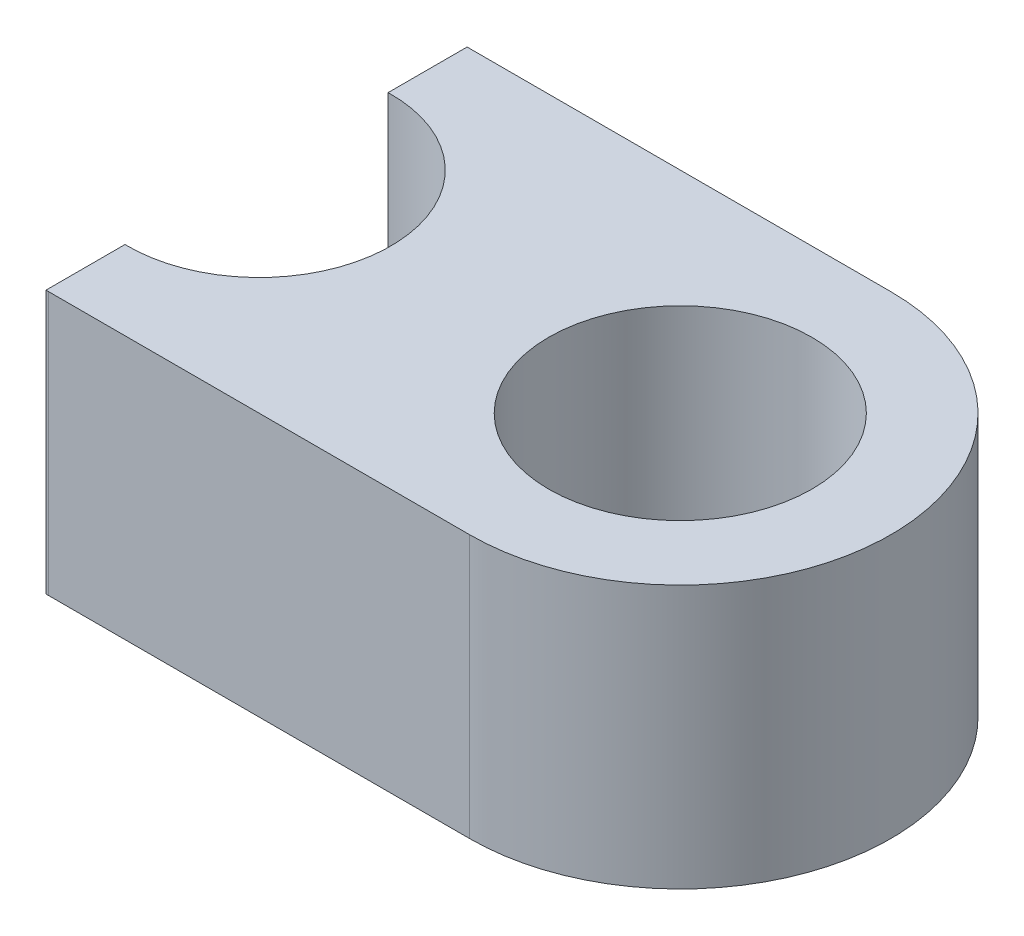
ISO-10303-21;
HEADER;
FILE_DESCRIPTION(('STEP AP214'),'2;1');
FILE_NAME('part.step','',(''),(''),'','','');
FILE_SCHEMA(('AUTOMOTIVE_DESIGN { 1 0 10303 214 1 1 1 1 }'));
ENDSEC;
DATA;
#1=APPLICATION_CONTEXT('core data for automotive mechanical design processes');
#2=APPLICATION_PROTOCOL_DEFINITION('international standard','automotive_design',2000,#1);
#3=PRODUCT_CONTEXT('',#1,'mechanical');
#4=PRODUCT('Part','Part','',(#3));
#5=PRODUCT_RELATED_PRODUCT_CATEGORY('part','',(#4));
#6=PRODUCT_DEFINITION_FORMATION('','',#4);
#7=PRODUCT_DEFINITION_CONTEXT('part definition',#1,'design');
#8=PRODUCT_DEFINITION('design','',#6,#7);
#9=PRODUCT_DEFINITION_SHAPE('','',#8);
#10=(LENGTH_UNIT() NAMED_UNIT(*) SI_UNIT(.MILLI.,.METRE.));
#11=(NAMED_UNIT(*) PLANE_ANGLE_UNIT() SI_UNIT($,.RADIAN.));
#12=(NAMED_UNIT(*) SI_UNIT($,.STERADIAN.) SOLID_ANGLE_UNIT());
#13=UNCERTAINTY_MEASURE_WITH_UNIT(LENGTH_MEASURE(1.E-05),#10,'distance_accuracy_value','');
#14=(GEOMETRIC_REPRESENTATION_CONTEXT(3) GLOBAL_UNCERTAINTY_ASSIGNED_CONTEXT((#13)) GLOBAL_UNIT_ASSIGNED_CONTEXT((#10,
#11,#12)) REPRESENTATION_CONTEXT('',''));
#15=CARTESIAN_POINT('',(0.,0.,0.));
#16=DIRECTION('',(0.,0.,1.));
#17=DIRECTION('',(1.,0.,0.));
#18=AXIS2_PLACEMENT_3D('',#15,#16,#17);
#19=CARTESIAN_POINT('',(0.,0.5,-4.40989998999799));
#20=DIRECTION('',(-1.,0.,0.));
#21=DIRECTION('',(0.,0.,1.));
#22=AXIS2_PLACEMENT_3D('',#19,#20,#21);
#23=PLANE('',#22);
#24=DIRECTION('',(0.,0.,1.));
#25=VECTOR('',#24,1.);
#26=CARTESIAN_POINT('',(0.,-0.500000044703484,-0.5));
#27=LINE('',#26,#25);
#28=CARTESIAN_POINT('',(0.,-0.500000044703484,-4.7099374975584));
#29=VERTEX_POINT('',#28);
#30=CARTESIAN_POINT('',(0.,-0.500000044703484,-4.40989998999799));
#31=VERTEX_POINT('',#30);
#32=EDGE_CURVE('E130',#29,#31,#27,.T.);
#33=ORIENTED_EDGE('',*,*,#32,.T.);
#34=DIRECTION('',(0.,-1.,0.));
#35=VECTOR('',#34,1.);
#36=CARTESIAN_POINT('',(0.,0.5,-4.40989998999799));
#37=LINE('',#36,#35);
#38=CARTESIAN_POINT('',(0.,0.5,-4.40989998999799));
#39=VERTEX_POINT('',#38);
#40=EDGE_CURVE('E95',#31,#39,#37,.F.);
#41=ORIENTED_EDGE('',*,*,#40,.T.);
#42=DIRECTION('',(0.,0.,1.));
#43=VECTOR('',#42,1.);
#44=CARTESIAN_POINT('',(0.,0.5,-0.5));
#45=LINE('',#44,#43);
#46=CARTESIAN_POINT('',(0.,0.5,-4.7099374975584));
#47=VERTEX_POINT('',#46);
#48=EDGE_CURVE('E92',#47,#39,#45,.T.);
#49=ORIENTED_EDGE('',*,*,#48,.F.);
#50=DIRECTION('',(0.,-1.,0.));
#51=VECTOR('',#50,1.);
#52=CARTESIAN_POINT('',(0.,0.5,-4.7099374975584));
#53=LINE('',#52,#51);
#54=EDGE_CURVE('E82',#29,#47,#53,.F.);
#55=ORIENTED_EDGE('',*,*,#54,.F.);
#56=EDGE_LOOP('',(#33,#41,#49,#55));
#57=FACE_BOUND('',#56,.T.);
#58=ADVANCED_FACE('F17',(#57),#23,.T.);
#59=CARTESIAN_POINT('',(0.0100000000004749,0.5,-3.91));
#60=DIRECTION('',(0.,-1.,0.));
#61=DIRECTION('',(0.,0.,-1.));
#62=AXIS2_PLACEMENT_3D('',#59,#60,#61);
#63=CYLINDRICAL_SURFACE('',#62,0.5);
#64=ORIENTED_EDGE('',*,*,#40,.F.);
#65=CARTESIAN_POINT('',(0.0100000000004749,-0.500000044703484,-3.91));
#66=DIRECTION('',(0.,-1.,0.));
#67=DIRECTION('',(0.,0.,-1.));
#68=AXIS2_PLACEMENT_3D('',#65,#66,#67);
#69=CIRCLE('',#68,0.5);
#70=CARTESIAN_POINT('',(0.,-0.500000044703484,-3.41010001000201));
#71=VERTEX_POINT('',#70);
#72=EDGE_CURVE('E127',#31,#71,#69,.T.);
#73=ORIENTED_EDGE('',*,*,#72,.T.);
#74=DIRECTION('',(0.,1.,0.));
#75=VECTOR('',#74,1.);
#76=CARTESIAN_POINT('',(0.,0.5,-3.41010001000201));
#77=LINE('',#76,#75);
#78=CARTESIAN_POINT('',(0.,0.5,-3.41010001000201));
#79=VERTEX_POINT('',#78);
#80=EDGE_CURVE('E112',#79,#71,#77,.F.);
#81=ORIENTED_EDGE('',*,*,#80,.F.);
#82=CARTESIAN_POINT('',(0.0100000000004749,0.5,-3.91));
#83=DIRECTION('',(0.,-1.,0.));
#84=DIRECTION('',(0.,0.,-1.));
#85=AXIS2_PLACEMENT_3D('',#82,#83,#84);
#86=CIRCLE('',#85,0.5);
#87=EDGE_CURVE('E97',#39,#79,#86,.T.);
#88=ORIENTED_EDGE('',*,*,#87,.F.);
#89=EDGE_LOOP('',(#64,#73,#81,#88));
#90=FACE_BOUND('',#89,.T.);
#91=ADVANCED_FACE('F169',(#90),#63,.F.);
#92=CARTESIAN_POINT('',(0.,0.5,-3.11006250244163));
#93=DIRECTION('',(-1.,0.,0.));
#94=DIRECTION('',(0.,0.,1.));
#95=AXIS2_PLACEMENT_3D('',#92,#93,#94);
#96=PLANE('',#95);
#97=DIRECTION('',(0.,0.,1.));
#98=VECTOR('',#97,1.);
#99=CARTESIAN_POINT('',(0.,-0.500000044703484,-0.5));
#100=LINE('',#99,#98);
#101=CARTESIAN_POINT('',(0.,-0.500000044703484,-3.1100625024416));
#102=VERTEX_POINT('',#101);
#103=EDGE_CURVE('E126',#71,#102,#100,.T.);
#104=ORIENTED_EDGE('',*,*,#103,.T.);
#105=DIRECTION('',(0.,-1.,0.));
#106=VECTOR('',#105,1.);
#107=CARTESIAN_POINT('',(0.,0.5,-3.1100625024416));
#108=LINE('',#107,#106);
#109=CARTESIAN_POINT('',(0.,0.5,-3.1100625024416));
#110=VERTEX_POINT('',#109);
#111=EDGE_CURVE('E110',#110,#102,#108,.T.);
#112=ORIENTED_EDGE('',*,*,#111,.F.);
#113=DIRECTION('',(0.,0.,1.));
#114=VECTOR('',#113,1.);
#115=CARTESIAN_POINT('',(0.,0.5,-0.5));
#116=LINE('',#115,#114);
#117=EDGE_CURVE('E99',#79,#110,#116,.T.);
#118=ORIENTED_EDGE('',*,*,#117,.F.);
#119=ORIENTED_EDGE('',*,*,#80,.T.);
#120=EDGE_LOOP('',(#104,#112,#118,#119));
#121=FACE_BOUND('',#120,.T.);
#122=ADVANCED_FACE('F142',(#121),#96,.T.);
#123=CARTESIAN_POINT('',(0.0100000000000273,0.5,-3.91));
#124=DIRECTION('',(0.,-1.,0.));
#125=DIRECTION('',(0.,0.,-1.));
#126=AXIS2_PLACEMENT_3D('',#123,#124,#125);
#127=CYLINDRICAL_SURFACE('',#126,0.8);
#128=CARTESIAN_POINT('',(0.0100000000000273,-0.500000044703484,-3.91));
#129=DIRECTION('',(0.,-1.,0.));
#130=DIRECTION('',(0.,0.,-1.));
#131=AXIS2_PLACEMENT_3D('',#128,#129,#130);
#132=CIRCLE('',#131,0.8);
#133=CARTESIAN_POINT('',(0.0100000000000273,-0.500000044703484,-3.11));
#134=VERTEX_POINT('',#133);
#135=EDGE_CURVE('E123',#102,#134,#132,.F.);
#136=ORIENTED_EDGE('',*,*,#135,.T.);
#137=DIRECTION('',(0.,1.,0.));
#138=VECTOR('',#137,1.);
#139=CARTESIAN_POINT('',(0.0100000000000273,0.5,-3.11));
#140=LINE('',#139,#138);
#141=CARTESIAN_POINT('',(0.0100000000000273,0.5,-3.11));
#142=VERTEX_POINT('',#141);
#143=EDGE_CURVE('E108',#142,#134,#140,.F.);
#144=ORIENTED_EDGE('',*,*,#143,.F.);
#145=CARTESIAN_POINT('',(0.0100000000000273,0.5,-3.91));
#146=DIRECTION('',(0.,1.,0.));
#147=DIRECTION('',(0.,0.,1.));
#148=AXIS2_PLACEMENT_3D('',#145,#146,#147);
#149=CIRCLE('',#148,0.8);
#150=EDGE_CURVE('E134',#110,#142,#149,.T.);
#151=ORIENTED_EDGE('',*,*,#150,.F.);
#152=ORIENTED_EDGE('',*,*,#111,.T.);
#153=EDGE_LOOP('',(#136,#144,#151,#152));
#154=FACE_BOUND('',#153,.T.);
#155=ADVANCED_FACE('F146',(#154),#127,.T.);
#156=CARTESIAN_POINT('',(1.61000000000003,0.5,-3.11));
#157=DIRECTION('',(0.,0.,1.));
#158=DIRECTION('',(1.,0.,0.));
#159=AXIS2_PLACEMENT_3D('',#156,#157,#158);
#160=PLANE('',#159);
#161=DIRECTION('',(1.,0.,0.));
#162=VECTOR('',#161,1.);
#163=CARTESIAN_POINT('',(0.5,-0.500000044703484,-3.11));
#164=LINE('',#163,#162);
#165=CARTESIAN_POINT('',(1.61000000000003,-0.500000044703484,-3.11));
#166=VERTEX_POINT('',#165);
#167=EDGE_CURVE('E122',#134,#166,#164,.T.);
#168=ORIENTED_EDGE('',*,*,#167,.T.);
#169=DIRECTION('',(0.,-1.,0.));
#170=VECTOR('',#169,1.);
#171=CARTESIAN_POINT('',(1.61000000000003,0.5,-3.11));
#172=LINE('',#171,#170);
#173=CARTESIAN_POINT('',(1.61000000000003,0.5,-3.11));
#174=VERTEX_POINT('',#173);
#175=EDGE_CURVE('E106',#174,#166,#172,.T.);
#176=ORIENTED_EDGE('',*,*,#175,.F.);
#177=DIRECTION('',(1.,0.,0.));
#178=VECTOR('',#177,1.);
#179=CARTESIAN_POINT('',(0.5,0.5,-3.11));
#180=LINE('',#179,#178);
#181=EDGE_CURVE('E133',#142,#174,#180,.T.);
#182=ORIENTED_EDGE('',*,*,#181,.F.);
#183=ORIENTED_EDGE('',*,*,#143,.T.);
#184=EDGE_LOOP('',(#168,#176,#182,#183));
#185=FACE_BOUND('',#184,.T.);
#186=ADVANCED_FACE('F152',(#185),#160,.T.);
#187=CARTESIAN_POINT('',(1.61000000000003,0.5,-3.91));
#188=DIRECTION('',(0.,-1.,0.));
#189=DIRECTION('',(0.,0.,-1.));
#190=AXIS2_PLACEMENT_3D('',#187,#188,#189);
#191=CYLINDRICAL_SURFACE('',#190,0.8);
#192=CARTESIAN_POINT('',(1.61000000000003,-0.500000044703484,-3.91));
#193=DIRECTION('',(0.,-1.,0.));
#194=DIRECTION('',(0.,0.,-1.));
#195=AXIS2_PLACEMENT_3D('',#192,#193,#194);
#196=CIRCLE('',#195,0.8);
#197=CARTESIAN_POINT('',(1.61000000000003,-0.500000044703484,-4.71));
#198=VERTEX_POINT('',#197);
#199=EDGE_CURVE('E119',#166,#198,#196,.F.);
#200=ORIENTED_EDGE('',*,*,#199,.T.);
#201=DIRECTION('',(0.,1.,0.));
#202=VECTOR('',#201,1.);
#203=CARTESIAN_POINT('',(1.61000000000003,0.5,-4.71));
#204=LINE('',#203,#202);
#205=CARTESIAN_POINT('',(1.61000000000003,0.5,-4.71));
#206=VERTEX_POINT('',#205);
#207=EDGE_CURVE('E103',#206,#198,#204,.F.);
#208=ORIENTED_EDGE('',*,*,#207,.F.);
#209=CARTESIAN_POINT('',(1.61000000000003,0.5,-3.91));
#210=DIRECTION('',(0.,-1.,0.));
#211=DIRECTION('',(0.,0.,-1.));
#212=AXIS2_PLACEMENT_3D('',#209,#210,#211);
#213=CIRCLE('',#212,0.8);
#214=EDGE_CURVE('E131',#174,#206,#213,.F.);
#215=ORIENTED_EDGE('',*,*,#214,.F.);
#216=ORIENTED_EDGE('',*,*,#175,.T.);
#217=EDGE_LOOP('',(#200,#208,#215,#216));
#218=FACE_BOUND('',#217,.T.);
#219=ADVANCED_FACE('F156',(#218),#191,.T.);
#220=CARTESIAN_POINT('',(0.0100000000000273,0.5,-4.71));
#221=DIRECTION('',(0.,0.,-1.));
#222=DIRECTION('',(-1.,0.,0.));
#223=AXIS2_PLACEMENT_3D('',#220,#221,#222);
#224=PLANE('',#223);
#225=DIRECTION('',(1.,0.,0.));
#226=VECTOR('',#225,1.);
#227=CARTESIAN_POINT('',(0.5,-0.500000044703484,-4.71));
#228=LINE('',#227,#226);
#229=CARTESIAN_POINT('',(0.0100000000000273,-0.500000044703484,-4.71));
#230=VERTEX_POINT('',#229);
#231=EDGE_CURVE('E118',#198,#230,#228,.F.);
#232=ORIENTED_EDGE('',*,*,#231,.T.);
#233=DIRECTION('',(0.,-1.,0.));
#234=VECTOR('',#233,1.);
#235=CARTESIAN_POINT('',(0.0100000000000273,0.5,-4.71));
#236=LINE('',#235,#234);
#237=CARTESIAN_POINT('',(0.0100000000000273,0.5,-4.71));
#238=VERTEX_POINT('',#237);
#239=EDGE_CURVE('E35',#238,#230,#236,.T.);
#240=ORIENTED_EDGE('',*,*,#239,.F.);
#241=DIRECTION('',(1.,0.,0.));
#242=VECTOR('',#241,1.);
#243=CARTESIAN_POINT('',(0.5,0.5,-4.71));
#244=LINE('',#243,#242);
#245=EDGE_CURVE('E94',#206,#238,#244,.F.);
#246=ORIENTED_EDGE('',*,*,#245,.F.);
#247=ORIENTED_EDGE('',*,*,#207,.T.);
#248=EDGE_LOOP('',(#232,#240,#246,#247));
#249=FACE_BOUND('',#248,.T.);
#250=ADVANCED_FACE('F159',(#249),#224,.T.);
#251=CARTESIAN_POINT('',(0.0100000000000273,0.5,-3.91));
#252=DIRECTION('',(0.,-1.,0.));
#253=DIRECTION('',(0.,0.,-1.));
#254=AXIS2_PLACEMENT_3D('',#251,#252,#253);
#255=CYLINDRICAL_SURFACE('',#254,0.8);
#256=CARTESIAN_POINT('',(0.0100000000000273,-0.500000044703484,-3.91));
#257=DIRECTION('',(0.,-1.,0.));
#258=DIRECTION('',(0.,0.,-1.));
#259=AXIS2_PLACEMENT_3D('',#256,#257,#258);
#260=CIRCLE('',#259,0.8);
#261=EDGE_CURVE('E85',#230,#29,#260,.F.);
#262=ORIENTED_EDGE('',*,*,#261,.T.);
#263=ORIENTED_EDGE('',*,*,#54,.T.);
#264=CARTESIAN_POINT('',(0.0100000000000273,0.5,-3.91));
#265=DIRECTION('',(0.,1.,0.));
#266=DIRECTION('',(0.,0.,1.));
#267=AXIS2_PLACEMENT_3D('',#264,#265,#266);
#268=CIRCLE('',#267,0.8);
#269=EDGE_CURVE('E20',#238,#47,#268,.T.);
#270=ORIENTED_EDGE('',*,*,#269,.F.);
#271=ORIENTED_EDGE('',*,*,#239,.T.);
#272=EDGE_LOOP('',(#262,#263,#270,#271));
#273=FACE_BOUND('',#272,.T.);
#274=ADVANCED_FACE('F84',(#273),#255,.T.);
#275=CARTESIAN_POINT('',(0.5,0.5,-0.5));
#276=DIRECTION('',(0.,1.,0.));
#277=DIRECTION('',(0.,0.,1.));
#278=AXIS2_PLACEMENT_3D('',#275,#276,#277);
#279=PLANE('',#278);
#280=CARTESIAN_POINT('',(1.61000000000048,0.5,-3.91));
#281=DIRECTION('',(0.,-1.,0.));
#282=DIRECTION('',(0.,0.,-1.));
#283=AXIS2_PLACEMENT_3D('',#280,#281,#282);
#284=CIRCLE('',#283,0.5);
#285=CARTESIAN_POINT('',(1.61000000000048,0.5,-4.41));
#286=VERTEX_POINT('',#285);
#287=EDGE_CURVE('E26',#286,#286,#284,.T.);
#288=ORIENTED_EDGE('',*,*,#287,.T.);
#289=EDGE_LOOP('',(#288));
#290=FACE_BOUND('',#289,.T.);
#291=ORIENTED_EDGE('',*,*,#214,.T.);
#292=ORIENTED_EDGE('',*,*,#245,.T.);
#293=ORIENTED_EDGE('',*,*,#269,.T.);
#294=ORIENTED_EDGE('',*,*,#48,.T.);
#295=ORIENTED_EDGE('',*,*,#87,.T.);
#296=ORIENTED_EDGE('',*,*,#117,.T.);
#297=ORIENTED_EDGE('',*,*,#150,.T.);
#298=ORIENTED_EDGE('',*,*,#181,.T.);
#299=EDGE_LOOP('',(#291,#292,#293,#294,#295,#296,#297,#298));
#300=FACE_BOUND('',#299,.T.);
#301=ADVANCED_FACE('F91',(#290,#300),#279,.T.);
#302=CARTESIAN_POINT('',(0.5,-0.500000044703484,-0.5));
#303=DIRECTION('',(0.,1.,0.));
#304=DIRECTION('',(0.,0.,1.));
#305=AXIS2_PLACEMENT_3D('',#302,#303,#304);
#306=PLANE('',#305);
#307=CARTESIAN_POINT('',(1.61000000000048,-0.500000044703484,-3.91));
#308=DIRECTION('',(0.,-1.,0.));
#309=DIRECTION('',(0.,0.,-1.));
#310=AXIS2_PLACEMENT_3D('',#307,#308,#309);
#311=CIRCLE('',#310,0.5);
#312=CARTESIAN_POINT('',(1.61000000000048,-0.500000044703484,-4.41));
#313=VERTEX_POINT('',#312);
#314=EDGE_CURVE('E11',#313,#313,#311,.F.);
#315=ORIENTED_EDGE('',*,*,#314,.T.);
#316=EDGE_LOOP('',(#315));
#317=FACE_BOUND('',#316,.T.);
#318=ORIENTED_EDGE('',*,*,#231,.F.);
#319=ORIENTED_EDGE('',*,*,#199,.F.);
#320=ORIENTED_EDGE('',*,*,#167,.F.);
#321=ORIENTED_EDGE('',*,*,#135,.F.);
#322=ORIENTED_EDGE('',*,*,#103,.F.);
#323=ORIENTED_EDGE('',*,*,#72,.F.);
#324=ORIENTED_EDGE('',*,*,#32,.F.);
#325=ORIENTED_EDGE('',*,*,#261,.F.);
#326=EDGE_LOOP('',(#318,#319,#320,#321,#322,#323,#324,#325));
#327=FACE_BOUND('',#326,.T.);
#328=ADVANCED_FACE('F166',(#317,#327),#306,.F.);
#329=CARTESIAN_POINT('',(1.61000000000048,0.5,-3.91));
#330=DIRECTION('',(0.,-1.,0.));
#331=DIRECTION('',(0.,0.,-1.));
#332=AXIS2_PLACEMENT_3D('',#329,#330,#331);
#333=CYLINDRICAL_SURFACE('',#332,0.5);
#334=ORIENTED_EDGE('',*,*,#287,.F.);
#335=EDGE_LOOP('',(#334));
#336=FACE_BOUND('',#335,.T.);
#337=ORIENTED_EDGE('',*,*,#314,.F.);
#338=EDGE_LOOP('',(#337));
#339=FACE_BOUND('',#338,.T.);
#340=ADVANCED_FACE('F177',(#336,#339),#333,.F.);
#341=CLOSED_SHELL('',(#58,#91,#122,#155,#186,#219,#250,#274,#301,#328,#340));
#342=MANIFOLD_SOLID_BREP('B1',#341);
#343=ADVANCED_BREP_SHAPE_REPRESENTATION('',(#18,#342),#14);
#344=SHAPE_DEFINITION_REPRESENTATION(#9,#343);
ENDSEC;
END-ISO-10303-21;
